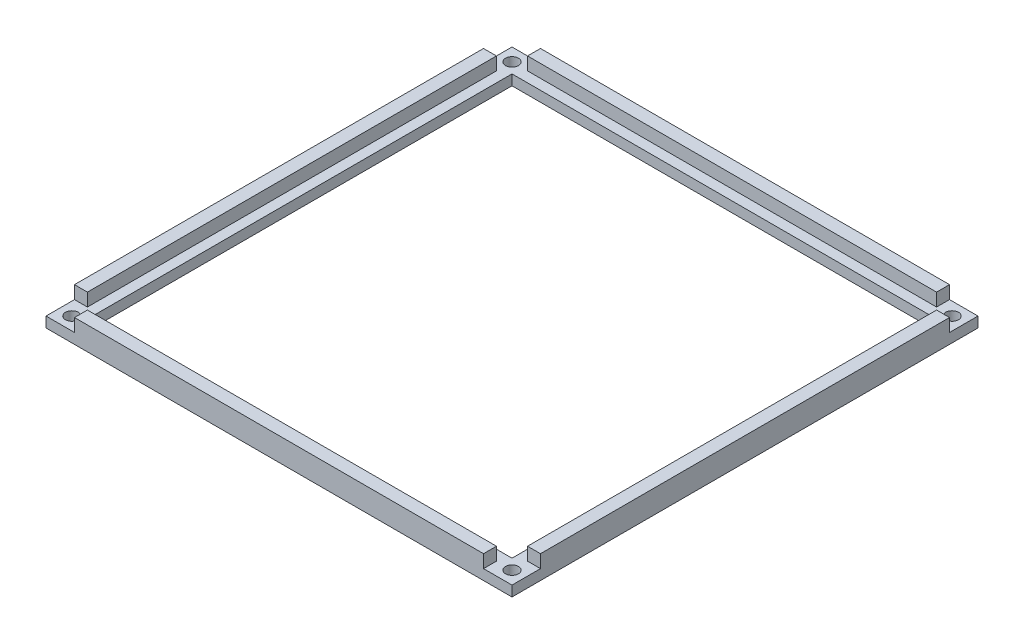
ISO-10303-21;
HEADER;
FILE_DESCRIPTION(('STEP AP214'),'2;1');
FILE_NAME('part.step','',(''),(''),'','','');
FILE_SCHEMA(('AUTOMOTIVE_DESIGN { 1 0 10303 214 1 1 1 1 }'));
ENDSEC;
DATA;
#1=APPLICATION_CONTEXT('core data for automotive mechanical design processes');
#2=APPLICATION_PROTOCOL_DEFINITION('international standard','automotive_design',2000,#1);
#3=PRODUCT_CONTEXT('',#1,'mechanical');
#4=PRODUCT('Part','Part','',(#3));
#5=PRODUCT_RELATED_PRODUCT_CATEGORY('part','',(#4));
#6=PRODUCT_DEFINITION_FORMATION('','',#4);
#7=PRODUCT_DEFINITION_CONTEXT('part definition',#1,'design');
#8=PRODUCT_DEFINITION('design','',#6,#7);
#9=PRODUCT_DEFINITION_SHAPE('','',#8);
#10=(LENGTH_UNIT() NAMED_UNIT(*) SI_UNIT(.MILLI.,.METRE.));
#11=(NAMED_UNIT(*) PLANE_ANGLE_UNIT() SI_UNIT($,.RADIAN.));
#12=(NAMED_UNIT(*) SI_UNIT($,.STERADIAN.) SOLID_ANGLE_UNIT());
#13=UNCERTAINTY_MEASURE_WITH_UNIT(LENGTH_MEASURE(1.E-05),#10,'distance_accuracy_value','');
#14=(GEOMETRIC_REPRESENTATION_CONTEXT(3) GLOBAL_UNCERTAINTY_ASSIGNED_CONTEXT((#13)) GLOBAL_UNIT_ASSIGNED_CONTEXT((#10,
#11,#12)) REPRESENTATION_CONTEXT('',''));
#15=CARTESIAN_POINT('',(0.,0.,0.));
#16=DIRECTION('',(0.,0.,1.));
#17=DIRECTION('',(1.,0.,0.));
#18=AXIS2_PLACEMENT_3D('',#15,#16,#17);
#19=CARTESIAN_POINT('',(0.,4.,0.));
#20=DIRECTION('',(0.,-1.,0.));
#21=DIRECTION('',(0.,0.,-1.));
#22=AXIS2_PLACEMENT_3D('',#19,#20,#21);
#23=PLANE('',#22);
#24=DIRECTION('',(0.,0.,1.));
#25=VECTOR('',#24,1.);
#26=CARTESIAN_POINT('',(19.,4.,-181.));
#27=LINE('',#26,#25);
#28=CARTESIAN_POINT('',(19.,4.,-181.));
#29=VERTEX_POINT('',#28);
#30=CARTESIAN_POINT('',(19.,4.,-19.));
#31=VERTEX_POINT('',#30);
#32=EDGE_CURVE('E204',#29,#31,#27,.T.);
#33=ORIENTED_EDGE('',*,*,#32,.F.);
#34=DIRECTION('',(-1.,0.,0.));
#35=VECTOR('',#34,1.);
#36=CARTESIAN_POINT('',(181.,4.,-181.));
#37=LINE('',#36,#35);
#38=CARTESIAN_POINT('',(181.,4.,-181.));
#39=VERTEX_POINT('',#38);
#40=EDGE_CURVE('E47',#39,#29,#37,.T.);
#41=ORIENTED_EDGE('',*,*,#40,.F.);
#42=DIRECTION('',(0.,0.,-1.));
#43=VECTOR('',#42,1.);
#44=CARTESIAN_POINT('',(181.,4.,-19.));
#45=LINE('',#44,#43);
#46=CARTESIAN_POINT('',(181.,4.,-19.));
#47=VERTEX_POINT('',#46);
#48=EDGE_CURVE('E210',#47,#39,#45,.T.);
#49=ORIENTED_EDGE('',*,*,#48,.F.);
#50=DIRECTION('',(1.,0.,0.));
#51=VECTOR('',#50,1.);
#52=CARTESIAN_POINT('',(19.,4.,-19.));
#53=LINE('',#52,#51);
#54=EDGE_CURVE('E195',#31,#47,#53,.T.);
#55=ORIENTED_EDGE('',*,*,#54,.F.);
#56=EDGE_LOOP('',(#33,#41,#49,#55));
#57=FACE_BOUND('',#56,.T.);
#58=CARTESIAN_POINT('',(15.,4.,-15.));
#59=DIRECTION('',(0.,1.,0.));
#60=DIRECTION('',(0.,0.,1.));
#61=AXIS2_PLACEMENT_3D('',#58,#59,#60);
#62=CIRCLE('',#61,2.5);
#63=CARTESIAN_POINT('',(15.,4.,-12.5));
#64=VERTEX_POINT('',#63);
#65=EDGE_CURVE('E364',#64,#64,#62,.T.);
#66=ORIENTED_EDGE('',*,*,#65,.F.);
#67=EDGE_LOOP('',(#66));
#68=FACE_BOUND('',#67,.T.);
#69=CARTESIAN_POINT('',(185.,4.,-15.0000000000001));
#70=DIRECTION('',(0.,1.,0.));
#71=DIRECTION('',(0.,0.,1.));
#72=AXIS2_PLACEMENT_3D('',#69,#70,#71);
#73=CIRCLE('',#72,2.5);
#74=CARTESIAN_POINT('',(185.,4.,-12.5000000000001));
#75=VERTEX_POINT('',#74);
#76=EDGE_CURVE('E370',#75,#75,#73,.T.);
#77=ORIENTED_EDGE('',*,*,#76,.F.);
#78=EDGE_LOOP('',(#77));
#79=FACE_BOUND('',#78,.T.);
#80=CARTESIAN_POINT('',(185.,4.,-185.));
#81=DIRECTION('',(0.,1.,0.));
#82=DIRECTION('',(0.,0.,1.));
#83=AXIS2_PLACEMENT_3D('',#80,#81,#82);
#84=CIRCLE('',#83,2.5);
#85=CARTESIAN_POINT('',(185.,4.,-182.5));
#86=VERTEX_POINT('',#85);
#87=EDGE_CURVE('E376',#86,#86,#84,.T.);
#88=ORIENTED_EDGE('',*,*,#87,.F.);
#89=EDGE_LOOP('',(#88));
#90=FACE_BOUND('',#89,.T.);
#91=CARTESIAN_POINT('',(15.,4.,-185.));
#92=DIRECTION('',(0.,1.,0.));
#93=DIRECTION('',(0.,0.,1.));
#94=AXIS2_PLACEMENT_3D('',#91,#92,#93);
#95=CIRCLE('',#94,2.5);
#96=CARTESIAN_POINT('',(15.,4.,-182.5));
#97=VERTEX_POINT('',#96);
#98=EDGE_CURVE('E382',#97,#97,#95,.T.);
#99=ORIENTED_EDGE('',*,*,#98,.F.);
#100=EDGE_LOOP('',(#99));
#101=FACE_BOUND('',#100,.T.);
#102=DIRECTION('',(1.,0.,0.));
#103=VECTOR('',#102,1.);
#104=CARTESIAN_POINT('',(10.0000000000015,4.,-21.0000000000009));
#105=LINE('',#104,#103);
#106=CARTESIAN_POINT('',(10.0000000000015,4.,-21.0000000000009));
#107=VERTEX_POINT('',#106);
#108=CARTESIAN_POINT('',(15.0000000000015,4.,-21.0000000000008));
#109=VERTEX_POINT('',#108);
#110=EDGE_CURVE('E217',#107,#109,#105,.T.);
#111=ORIENTED_EDGE('',*,*,#110,.F.);
#112=DIRECTION('',(0.,0.,1.));
#113=VECTOR('',#112,1.);
#114=CARTESIAN_POINT('',(9.99999999999997,4.,-190.));
#115=LINE('',#114,#113);
#116=CARTESIAN_POINT('',(9.99999999999997,4.,-10.));
#117=VERTEX_POINT('',#116);
#118=EDGE_CURVE('E339',#107,#117,#115,.T.);
#119=ORIENTED_EDGE('',*,*,#118,.T.);
#120=DIRECTION('',(1.,0.,0.));
#121=VECTOR('',#120,1.);
#122=CARTESIAN_POINT('',(9.99999999999997,4.,-10.));
#123=LINE('',#122,#121);
#124=CARTESIAN_POINT('',(21.0000000000018,4.,-10.));
#125=VERTEX_POINT('',#124);
#126=EDGE_CURVE('E343',#117,#125,#123,.T.);
#127=ORIENTED_EDGE('',*,*,#126,.T.);
#128=DIRECTION('',(0.,0.,1.));
#129=VECTOR('',#128,1.);
#130=CARTESIAN_POINT('',(21.0000000000018,4.,-10.0000000000028));
#131=LINE('',#130,#129);
#132=CARTESIAN_POINT('',(21.0000000000018,4.,-15.0000000000028));
#133=VERTEX_POINT('',#132);
#134=EDGE_CURVE('E254',#133,#125,#131,.T.);
#135=ORIENTED_EDGE('',*,*,#134,.F.);
#136=DIRECTION('',(-1.,0.,0.));
#137=VECTOR('',#136,1.);
#138=CARTESIAN_POINT('',(179.000000000002,4.,-15.0000000000017));
#139=LINE('',#138,#137);
#140=CARTESIAN_POINT('',(179.000000000002,4.,-15.0000000000017));
#141=VERTEX_POINT('',#140);
#142=EDGE_CURVE('E263',#141,#133,#139,.T.);
#143=ORIENTED_EDGE('',*,*,#142,.F.);
#144=DIRECTION('',(0.,0.,-1.));
#145=VECTOR('',#144,1.);
#146=CARTESIAN_POINT('',(179.000000000002,4.,-10.0000000000017));
#147=LINE('',#146,#145);
#148=CARTESIAN_POINT('',(179.000000000002,4.,-10.0000000000017));
#149=VERTEX_POINT('',#148);
#150=EDGE_CURVE('E249',#149,#141,#147,.T.);
#151=ORIENTED_EDGE('',*,*,#150,.F.);
#152=CARTESIAN_POINT('',(190.,4.,-10.));
#153=VERTEX_POINT('',#152);
#154=EDGE_CURVE('E342',#149,#153,#123,.T.);
#155=ORIENTED_EDGE('',*,*,#154,.T.);
#156=DIRECTION('',(0.,0.,-1.));
#157=VECTOR('',#156,1.);
#158=CARTESIAN_POINT('',(190.,4.,-10.));
#159=LINE('',#158,#157);
#160=CARTESIAN_POINT('',(190.,4.,-21.000000000002));
#161=VERTEX_POINT('',#160);
#162=EDGE_CURVE('E346',#153,#161,#159,.T.);
#163=ORIENTED_EDGE('',*,*,#162,.T.);
#164=DIRECTION('',(1.,0.,0.));
#165=VECTOR('',#164,1.);
#166=CARTESIAN_POINT('',(190.,4.,-21.000000000002));
#167=LINE('',#166,#165);
#168=CARTESIAN_POINT('',(185.,4.,-21.0000000000021));
#169=VERTEX_POINT('',#168);
#170=EDGE_CURVE('E284',#169,#161,#167,.T.);
#171=ORIENTED_EDGE('',*,*,#170,.F.);
#172=DIRECTION('',(0.,0.,1.));
#173=VECTOR('',#172,1.);
#174=CARTESIAN_POINT('',(185.,4.,-179.000000000002));
#175=LINE('',#174,#173);
#176=CARTESIAN_POINT('',(185.,4.,-179.000000000002));
#177=VERTEX_POINT('',#176);
#178=EDGE_CURVE('E293',#177,#169,#175,.T.);
#179=ORIENTED_EDGE('',*,*,#178,.F.);
#180=DIRECTION('',(-1.,0.,0.));
#181=VECTOR('',#180,1.);
#182=CARTESIAN_POINT('',(190.,4.,-179.000000000002));
#183=LINE('',#182,#181);
#184=CARTESIAN_POINT('',(190.,4.,-179.000000000002));
#185=VERTEX_POINT('',#184);
#186=EDGE_CURVE('E279',#185,#177,#183,.T.);
#187=ORIENTED_EDGE('',*,*,#186,.F.);
#188=CARTESIAN_POINT('',(190.,4.,-190.));
#189=VERTEX_POINT('',#188);
#190=EDGE_CURVE('E345',#185,#189,#159,.T.);
#191=ORIENTED_EDGE('',*,*,#190,.T.);
#192=DIRECTION('',(-1.,0.,0.));
#193=VECTOR('',#192,1.);
#194=CARTESIAN_POINT('',(190.,4.,-190.));
#195=LINE('',#194,#193);
#196=CARTESIAN_POINT('',(179.,4.,-190.));
#197=VERTEX_POINT('',#196);
#198=EDGE_CURVE('E349',#189,#197,#195,.T.);
#199=ORIENTED_EDGE('',*,*,#198,.T.);
#200=DIRECTION('',(0.,0.,-1.));
#201=VECTOR('',#200,1.);
#202=CARTESIAN_POINT('',(179.,4.,-190.));
#203=LINE('',#202,#201);
#204=CARTESIAN_POINT('',(179.,4.,-185.));
#205=VERTEX_POINT('',#204);
#206=EDGE_CURVE('E314',#205,#197,#203,.T.);
#207=ORIENTED_EDGE('',*,*,#206,.F.);
#208=DIRECTION('',(1.,0.,0.));
#209=VECTOR('',#208,1.);
#210=CARTESIAN_POINT('',(21.,4.,-185.));
#211=LINE('',#210,#209);
#212=CARTESIAN_POINT('',(21.,4.,-185.));
#213=VERTEX_POINT('',#212);
#214=EDGE_CURVE('E323',#213,#205,#211,.T.);
#215=ORIENTED_EDGE('',*,*,#214,.F.);
#216=DIRECTION('',(0.,0.,1.));
#217=VECTOR('',#216,1.);
#218=CARTESIAN_POINT('',(21.,4.,-190.));
#219=LINE('',#218,#217);
#220=CARTESIAN_POINT('',(21.0000000000001,4.,-190.));
#221=VERTEX_POINT('',#220);
#222=EDGE_CURVE('E309',#221,#213,#219,.T.);
#223=ORIENTED_EDGE('',*,*,#222,.F.);
#224=CARTESIAN_POINT('',(9.99999999999997,4.,-190.));
#225=VERTEX_POINT('',#224);
#226=EDGE_CURVE('E348',#221,#225,#195,.T.);
#227=ORIENTED_EDGE('',*,*,#226,.T.);
#228=CARTESIAN_POINT('',(9.99999999999997,4.,-179.000000000001));
#229=VERTEX_POINT('',#228);
#230=EDGE_CURVE('E340',#225,#229,#115,.T.);
#231=ORIENTED_EDGE('',*,*,#230,.T.);
#232=DIRECTION('',(-1.,0.,0.));
#233=VECTOR('',#232,1.);
#234=CARTESIAN_POINT('',(10.0000000000032,4.,-179.000000000001));
#235=LINE('',#234,#233);
#236=CARTESIAN_POINT('',(15.0000000000032,4.,-179.000000000001));
#237=VERTEX_POINT('',#236);
#238=EDGE_CURVE('E224',#237,#229,#235,.T.);
#239=ORIENTED_EDGE('',*,*,#238,.F.);
#240=DIRECTION('',(0.,0.,-1.));
#241=VECTOR('',#240,1.);
#242=CARTESIAN_POINT('',(15.0000000000015,4.,-21.0000000000008));
#243=LINE('',#242,#241);
#244=EDGE_CURVE('E233',#109,#237,#243,.T.);
#245=ORIENTED_EDGE('',*,*,#244,.F.);
#246=EDGE_LOOP('',(#111,#119,#127,#135,#143,#151,#155,#163,#171,#179,#187,#191,#199,#207,#215,
#223,#227,#231,#239,#245));
#247=FACE_BOUND('',#246,.T.);
#248=ADVANCED_FACE('F32',(#57,#68,#79,#90,#101,#247),#23,.F.);
#249=CARTESIAN_POINT('',(0.,0.,0.));
#250=DIRECTION('',(0.,-1.,0.));
#251=DIRECTION('',(0.,0.,-1.));
#252=AXIS2_PLACEMENT_3D('',#249,#250,#251);
#253=PLANE('',#252);
#254=DIRECTION('',(1.,0.,0.));
#255=VECTOR('',#254,1.);
#256=CARTESIAN_POINT('',(0.,0.,-181.));
#257=LINE('',#256,#255);
#258=CARTESIAN_POINT('',(19.,0.,-181.));
#259=VERTEX_POINT('',#258);
#260=CARTESIAN_POINT('',(181.,0.,-181.));
#261=VERTEX_POINT('',#260);
#262=EDGE_CURVE('E11',#259,#261,#257,.T.);
#263=ORIENTED_EDGE('',*,*,#262,.F.);
#264=DIRECTION('',(0.,0.,-1.));
#265=VECTOR('',#264,1.);
#266=CARTESIAN_POINT('',(19.,0.,0.));
#267=LINE('',#266,#265);
#268=CARTESIAN_POINT('',(19.,0.,-19.));
#269=VERTEX_POINT('',#268);
#270=EDGE_CURVE('E399',#269,#259,#267,.T.);
#271=ORIENTED_EDGE('',*,*,#270,.F.);
#272=DIRECTION('',(-1.,0.,0.));
#273=VECTOR('',#272,1.);
#274=CARTESIAN_POINT('',(0.,0.,-19.));
#275=LINE('',#274,#273);
#276=CARTESIAN_POINT('',(181.,0.,-19.));
#277=VERTEX_POINT('',#276);
#278=EDGE_CURVE('E198',#277,#269,#275,.T.);
#279=ORIENTED_EDGE('',*,*,#278,.F.);
#280=DIRECTION('',(0.,0.,1.));
#281=VECTOR('',#280,1.);
#282=CARTESIAN_POINT('',(181.,0.,0.));
#283=LINE('',#282,#281);
#284=EDGE_CURVE('E40',#261,#277,#283,.T.);
#285=ORIENTED_EDGE('',*,*,#284,.F.);
#286=EDGE_LOOP('',(#263,#271,#279,#285));
#287=FACE_BOUND('',#286,.T.);
#288=CARTESIAN_POINT('',(15.,0.,-15.));
#289=DIRECTION('',(0.,1.,0.));
#290=DIRECTION('',(0.,0.,1.));
#291=AXIS2_PLACEMENT_3D('',#288,#289,#290);
#292=CIRCLE('',#291,2.5);
#293=CARTESIAN_POINT('',(15.,0.,-12.5));
#294=VERTEX_POINT('',#293);
#295=EDGE_CURVE('E355',#294,#294,#292,.T.);
#296=ORIENTED_EDGE('',*,*,#295,.T.);
#297=EDGE_LOOP('',(#296));
#298=FACE_BOUND('',#297,.T.);
#299=CARTESIAN_POINT('',(185.,0.,-185.));
#300=DIRECTION('',(0.,1.,0.));
#301=DIRECTION('',(0.,0.,1.));
#302=AXIS2_PLACEMENT_3D('',#299,#300,#301);
#303=CIRCLE('',#302,2.5);
#304=CARTESIAN_POINT('',(185.,0.,-182.5));
#305=VERTEX_POINT('',#304);
#306=EDGE_CURVE('E373',#305,#305,#303,.T.);
#307=ORIENTED_EDGE('',*,*,#306,.T.);
#308=EDGE_LOOP('',(#307));
#309=FACE_BOUND('',#308,.T.);
#310=CARTESIAN_POINT('',(15.,0.,-185.));
#311=DIRECTION('',(0.,1.,0.));
#312=DIRECTION('',(0.,0.,1.));
#313=AXIS2_PLACEMENT_3D('',#310,#311,#312);
#314=CIRCLE('',#313,2.5);
#315=CARTESIAN_POINT('',(15.,0.,-182.5));
#316=VERTEX_POINT('',#315);
#317=EDGE_CURVE('E379',#316,#316,#314,.T.);
#318=ORIENTED_EDGE('',*,*,#317,.T.);
#319=EDGE_LOOP('',(#318));
#320=FACE_BOUND('',#319,.T.);
#321=CARTESIAN_POINT('',(185.,0.,-15.0000000000001));
#322=DIRECTION('',(0.,1.,0.));
#323=DIRECTION('',(0.,0.,1.));
#324=AXIS2_PLACEMENT_3D('',#321,#322,#323);
#325=CIRCLE('',#324,2.5);
#326=CARTESIAN_POINT('',(185.,0.,-12.5000000000001));
#327=VERTEX_POINT('',#326);
#328=EDGE_CURVE('E367',#327,#327,#325,.T.);
#329=ORIENTED_EDGE('',*,*,#328,.T.);
#330=EDGE_LOOP('',(#329));
#331=FACE_BOUND('',#330,.T.);
#332=DIRECTION('',(-1.,0.,0.));
#333=VECTOR('',#332,1.);
#334=CARTESIAN_POINT('',(0.,0.,-10.));
#335=LINE('',#334,#333);
#336=CARTESIAN_POINT('',(190.,0.,-10.));
#337=VERTEX_POINT('',#336);
#338=CARTESIAN_POINT('',(9.99999999999997,0.,-10.));
#339=VERTEX_POINT('',#338);
#340=EDGE_CURVE('E385',#337,#339,#335,.T.);
#341=ORIENTED_EDGE('',*,*,#340,.T.);
#342=DIRECTION('',(0.,0.,-1.));
#343=VECTOR('',#342,1.);
#344=CARTESIAN_POINT('',(9.99999999999997,0.,0.));
#345=LINE('',#344,#343);
#346=CARTESIAN_POINT('',(9.99999999999997,0.,-190.));
#347=VERTEX_POINT('',#346);
#348=EDGE_CURVE('E396',#339,#347,#345,.T.);
#349=ORIENTED_EDGE('',*,*,#348,.T.);
#350=DIRECTION('',(1.,0.,0.));
#351=VECTOR('',#350,1.);
#352=CARTESIAN_POINT('',(0.,0.,-190.));
#353=LINE('',#352,#351);
#354=CARTESIAN_POINT('',(190.,0.,-190.));
#355=VERTEX_POINT('',#354);
#356=EDGE_CURVE('E393',#347,#355,#353,.T.);
#357=ORIENTED_EDGE('',*,*,#356,.T.);
#358=DIRECTION('',(0.,0.,1.));
#359=VECTOR('',#358,1.);
#360=CARTESIAN_POINT('',(190.,0.,0.));
#361=LINE('',#360,#359);
#362=EDGE_CURVE('E390',#355,#337,#361,.T.);
#363=ORIENTED_EDGE('',*,*,#362,.T.);
#364=EDGE_LOOP('',(#341,#349,#357,#363));
#365=FACE_BOUND('',#364,.T.);
#366=ADVANCED_FACE('F34',(#287,#298,#309,#320,#331,#365),#253,.T.);
#367=CARTESIAN_POINT('',(15.,4.,-185.));
#368=DIRECTION('',(0.,-1.,0.));
#369=DIRECTION('',(0.,0.,-1.));
#370=AXIS2_PLACEMENT_3D('',#367,#368,#369);
#371=CYLINDRICAL_SURFACE('',#370,2.5);
#372=ORIENTED_EDGE('',*,*,#98,.T.);
#373=EDGE_LOOP('',(#372));
#374=FACE_BOUND('',#373,.T.);
#375=ORIENTED_EDGE('',*,*,#317,.F.);
#376=EDGE_LOOP('',(#375));
#377=FACE_BOUND('',#376,.T.);
#378=ADVANCED_FACE('F425',(#374,#377),#371,.F.);
#379=CARTESIAN_POINT('',(185.,4.,-185.));
#380=DIRECTION('',(0.,-1.,0.));
#381=DIRECTION('',(0.,0.,-1.));
#382=AXIS2_PLACEMENT_3D('',#379,#380,#381);
#383=CYLINDRICAL_SURFACE('',#382,2.5);
#384=ORIENTED_EDGE('',*,*,#87,.T.);
#385=EDGE_LOOP('',(#384));
#386=FACE_BOUND('',#385,.T.);
#387=ORIENTED_EDGE('',*,*,#306,.F.);
#388=EDGE_LOOP('',(#387));
#389=FACE_BOUND('',#388,.T.);
#390=ADVANCED_FACE('F429',(#386,#389),#383,.F.);
#391=CARTESIAN_POINT('',(185.,4.,-15.0000000000001));
#392=DIRECTION('',(0.,-1.,0.));
#393=DIRECTION('',(0.,0.,-1.));
#394=AXIS2_PLACEMENT_3D('',#391,#392,#393);
#395=CYLINDRICAL_SURFACE('',#394,2.5);
#396=ORIENTED_EDGE('',*,*,#76,.T.);
#397=EDGE_LOOP('',(#396));
#398=FACE_BOUND('',#397,.T.);
#399=ORIENTED_EDGE('',*,*,#328,.F.);
#400=EDGE_LOOP('',(#399));
#401=FACE_BOUND('',#400,.T.);
#402=ADVANCED_FACE('F433',(#398,#401),#395,.F.);
#403=CARTESIAN_POINT('',(15.,4.,-15.));
#404=DIRECTION('',(0.,-1.,0.));
#405=DIRECTION('',(0.,0.,-1.));
#406=AXIS2_PLACEMENT_3D('',#403,#404,#405);
#407=CYLINDRICAL_SURFACE('',#406,2.5);
#408=ORIENTED_EDGE('',*,*,#65,.T.);
#409=EDGE_LOOP('',(#408));
#410=FACE_BOUND('',#409,.T.);
#411=ORIENTED_EDGE('',*,*,#295,.F.);
#412=EDGE_LOOP('',(#411));
#413=FACE_BOUND('',#412,.T.);
#414=ADVANCED_FACE('F437',(#410,#413),#407,.F.);
#415=CARTESIAN_POINT('',(9.99999999999997,-6.,-190.));
#416=DIRECTION('',(-1.,0.,0.));
#417=DIRECTION('',(0.,0.,1.));
#418=AXIS2_PLACEMENT_3D('',#415,#416,#417);
#419=PLANE('',#418);
#420=DIRECTION('',(0.,1.,0.));
#421=VECTOR('',#420,1.);
#422=CARTESIAN_POINT('',(9.99999999999997,-6.,-10.));
#423=LINE('',#422,#421);
#424=EDGE_CURVE('E351',#339,#117,#423,.T.);
#425=ORIENTED_EDGE('',*,*,#424,.T.);
#426=ORIENTED_EDGE('',*,*,#118,.F.);
#427=DIRECTION('',(0.,-1.,0.));
#428=VECTOR('',#427,1.);
#429=CARTESIAN_POINT('',(10.0000000000015,9.,-21.0000000000009));
#430=LINE('',#429,#428);
#431=CARTESIAN_POINT('',(10.0000000000015,9.,-21.0000000000009));
#432=VERTEX_POINT('',#431);
#433=EDGE_CURVE('E246',#432,#107,#430,.T.);
#434=ORIENTED_EDGE('',*,*,#433,.F.);
#435=DIRECTION('',(0.,0.,1.));
#436=VECTOR('',#435,1.);
#437=CARTESIAN_POINT('',(10.0000000000015,9.,-21.0000000000009));
#438=LINE('',#437,#436);
#439=CARTESIAN_POINT('',(10.0000000000032,9.,-179.000000000001));
#440=VERTEX_POINT('',#439);
#441=EDGE_CURVE('E220',#440,#432,#438,.T.);
#442=ORIENTED_EDGE('',*,*,#441,.F.);
#443=DIRECTION('',(0.,-1.,0.));
#444=VECTOR('',#443,1.);
#445=CARTESIAN_POINT('',(10.0000000000032,9.,-179.000000000001));
#446=LINE('',#445,#444);
#447=EDGE_CURVE('E230',#440,#229,#446,.T.);
#448=ORIENTED_EDGE('',*,*,#447,.T.);
#449=ORIENTED_EDGE('',*,*,#230,.F.);
#450=DIRECTION('',(0.,1.,0.));
#451=VECTOR('',#450,1.);
#452=CARTESIAN_POINT('',(9.99999999999997,-6.,-190.));
#453=LINE('',#452,#451);
#454=EDGE_CURVE('E352',#347,#225,#453,.T.);
#455=ORIENTED_EDGE('',*,*,#454,.F.);
#456=ORIENTED_EDGE('',*,*,#348,.F.);
#457=EDGE_LOOP('',(#425,#426,#434,#442,#448,#449,#455,#456));
#458=FACE_BOUND('',#457,.T.);
#459=ADVANCED_FACE('F441',(#458),#419,.T.);
#460=CARTESIAN_POINT('',(190.,-6.,-190.));
#461=DIRECTION('',(0.,0.,-1.));
#462=DIRECTION('',(-1.,0.,0.));
#463=AXIS2_PLACEMENT_3D('',#460,#461,#462);
#464=PLANE('',#463);
#465=ORIENTED_EDGE('',*,*,#454,.T.);
#466=ORIENTED_EDGE('',*,*,#226,.F.);
#467=DIRECTION('',(0.,-1.,0.));
#468=VECTOR('',#467,1.);
#469=CARTESIAN_POINT('',(21.,9.,-190.));
#470=LINE('',#469,#468);
#471=CARTESIAN_POINT('',(21.,9.,-190.));
#472=VERTEX_POINT('',#471);
#473=EDGE_CURVE('E320',#472,#221,#470,.T.);
#474=ORIENTED_EDGE('',*,*,#473,.F.);
#475=DIRECTION('',(-1.,0.,0.));
#476=VECTOR('',#475,1.);
#477=CARTESIAN_POINT('',(21.,9.,-190.));
#478=LINE('',#477,#476);
#479=CARTESIAN_POINT('',(179.,9.,-190.));
#480=VERTEX_POINT('',#479);
#481=EDGE_CURVE('E318',#480,#472,#478,.T.);
#482=ORIENTED_EDGE('',*,*,#481,.F.);
#483=DIRECTION('',(0.,-1.,0.));
#484=VECTOR('',#483,1.);
#485=CARTESIAN_POINT('',(179.,9.,-190.));
#486=LINE('',#485,#484);
#487=EDGE_CURVE('E330',#480,#197,#486,.T.);
#488=ORIENTED_EDGE('',*,*,#487,.T.);
#489=ORIENTED_EDGE('',*,*,#198,.F.);
#490=DIRECTION('',(0.,1.,0.));
#491=VECTOR('',#490,1.);
#492=CARTESIAN_POINT('',(190.,-6.,-190.));
#493=LINE('',#492,#491);
#494=EDGE_CURVE('E356',#355,#189,#493,.T.);
#495=ORIENTED_EDGE('',*,*,#494,.F.);
#496=ORIENTED_EDGE('',*,*,#356,.F.);
#497=EDGE_LOOP('',(#465,#466,#474,#482,#488,#489,#495,#496));
#498=FACE_BOUND('',#497,.T.);
#499=ADVANCED_FACE('F445',(#498),#464,.T.);
#500=CARTESIAN_POINT('',(190.,-6.,-10.));
#501=DIRECTION('',(1.,0.,0.));
#502=DIRECTION('',(0.,0.,-1.));
#503=AXIS2_PLACEMENT_3D('',#500,#501,#502);
#504=PLANE('',#503);
#505=ORIENTED_EDGE('',*,*,#494,.T.);
#506=ORIENTED_EDGE('',*,*,#190,.F.);
#507=DIRECTION('',(0.,-1.,0.));
#508=VECTOR('',#507,1.);
#509=CARTESIAN_POINT('',(190.,9.,-179.000000000002));
#510=LINE('',#509,#508);
#511=CARTESIAN_POINT('',(190.,9.,-179.000000000002));
#512=VERTEX_POINT('',#511);
#513=EDGE_CURVE('E306',#512,#185,#510,.T.);
#514=ORIENTED_EDGE('',*,*,#513,.F.);
#515=DIRECTION('',(0.,0.,-1.));
#516=VECTOR('',#515,1.);
#517=CARTESIAN_POINT('',(190.,9.,-179.000000000002));
#518=LINE('',#517,#516);
#519=CARTESIAN_POINT('',(190.,9.,-21.000000000002));
#520=VERTEX_POINT('',#519);
#521=EDGE_CURVE('E280',#520,#512,#518,.T.);
#522=ORIENTED_EDGE('',*,*,#521,.F.);
#523=DIRECTION('',(0.,-1.,0.));
#524=VECTOR('',#523,1.);
#525=CARTESIAN_POINT('',(190.,9.,-21.000000000002));
#526=LINE('',#525,#524);
#527=EDGE_CURVE('E290',#520,#161,#526,.T.);
#528=ORIENTED_EDGE('',*,*,#527,.T.);
#529=ORIENTED_EDGE('',*,*,#162,.F.);
#530=DIRECTION('',(0.,1.,0.));
#531=VECTOR('',#530,1.);
#532=CARTESIAN_POINT('',(190.,-6.,-10.));
#533=LINE('',#532,#531);
#534=EDGE_CURVE('E359',#337,#153,#533,.T.);
#535=ORIENTED_EDGE('',*,*,#534,.F.);
#536=ORIENTED_EDGE('',*,*,#362,.F.);
#537=EDGE_LOOP('',(#505,#506,#514,#522,#528,#529,#535,#536));
#538=FACE_BOUND('',#537,.T.);
#539=ADVANCED_FACE('F451',(#538),#504,.T.);
#540=CARTESIAN_POINT('',(9.99999999999997,-6.,-10.));
#541=DIRECTION('',(0.,0.,1.));
#542=DIRECTION('',(1.,0.,0.));
#543=AXIS2_PLACEMENT_3D('',#540,#541,#542);
#544=PLANE('',#543);
#545=ORIENTED_EDGE('',*,*,#534,.T.);
#546=ORIENTED_EDGE('',*,*,#154,.F.);
#547=DIRECTION('',(0.,-1.,0.));
#548=VECTOR('',#547,1.);
#549=CARTESIAN_POINT('',(179.000000000002,9.,-10.0000000000017));
#550=LINE('',#549,#548);
#551=CARTESIAN_POINT('',(179.000000000002,9.,-10.0000000000017));
#552=VERTEX_POINT('',#551);
#553=EDGE_CURVE('E276',#552,#149,#550,.T.);
#554=ORIENTED_EDGE('',*,*,#553,.F.);
#555=DIRECTION('',(1.,0.,0.));
#556=VECTOR('',#555,1.);
#557=CARTESIAN_POINT('',(179.000000000002,9.,-10.0000000000017));
#558=LINE('',#557,#556);
#559=CARTESIAN_POINT('',(21.0000000000018,9.,-10.0000000000028));
#560=VERTEX_POINT('',#559);
#561=EDGE_CURVE('E250',#560,#552,#558,.T.);
#562=ORIENTED_EDGE('',*,*,#561,.F.);
#563=DIRECTION('',(0.,-1.,0.));
#564=VECTOR('',#563,1.);
#565=CARTESIAN_POINT('',(21.0000000000018,9.,-10.0000000000028));
#566=LINE('',#565,#564);
#567=EDGE_CURVE('E260',#560,#125,#566,.T.);
#568=ORIENTED_EDGE('',*,*,#567,.T.);
#569=ORIENTED_EDGE('',*,*,#126,.F.);
#570=ORIENTED_EDGE('',*,*,#424,.F.);
#571=ORIENTED_EDGE('',*,*,#340,.F.);
#572=EDGE_LOOP('',(#545,#546,#554,#562,#568,#569,#570,#571));
#573=FACE_BOUND('',#572,.T.);
#574=ADVANCED_FACE('F447',(#573),#544,.T.);
#575=CARTESIAN_POINT('',(21.,9.,-190.));
#576=DIRECTION('',(1.,0.,0.));
#577=DIRECTION('',(0.,0.,-1.));
#578=AXIS2_PLACEMENT_3D('',#575,#576,#577);
#579=PLANE('',#578);
#580=ORIENTED_EDGE('',*,*,#222,.T.);
#581=DIRECTION('',(0.,-1.,0.));
#582=VECTOR('',#581,1.);
#583=CARTESIAN_POINT('',(21.,9.,-185.));
#584=LINE('',#583,#582);
#585=CARTESIAN_POINT('',(21.,9.,-185.));
#586=VERTEX_POINT('',#585);
#587=EDGE_CURVE('E336',#586,#213,#584,.T.);
#588=ORIENTED_EDGE('',*,*,#587,.F.);
#589=DIRECTION('',(0.,0.,1.));
#590=VECTOR('',#589,1.);
#591=CARTESIAN_POINT('',(21.,9.,-190.));
#592=LINE('',#591,#590);
#593=EDGE_CURVE('E310',#472,#586,#592,.T.);
#594=ORIENTED_EDGE('',*,*,#593,.F.);
#595=ORIENTED_EDGE('',*,*,#473,.T.);
#596=EDGE_LOOP('',(#580,#588,#594,#595));
#597=FACE_BOUND('',#596,.T.);
#598=ADVANCED_FACE('F450',(#597),#579,.F.);
#599=CARTESIAN_POINT('',(21.,9.,-185.));
#600=DIRECTION('',(0.,0.,-1.));
#601=DIRECTION('',(-1.,0.,0.));
#602=AXIS2_PLACEMENT_3D('',#599,#600,#601);
#603=PLANE('',#602);
#604=ORIENTED_EDGE('',*,*,#214,.T.);
#605=DIRECTION('',(0.,-1.,0.));
#606=VECTOR('',#605,1.);
#607=CARTESIAN_POINT('',(179.,9.,-185.));
#608=LINE('',#607,#606);
#609=CARTESIAN_POINT('',(179.,9.,-185.));
#610=VERTEX_POINT('',#609);
#611=EDGE_CURVE('E333',#610,#205,#608,.T.);
#612=ORIENTED_EDGE('',*,*,#611,.F.);
#613=DIRECTION('',(1.,0.,0.));
#614=VECTOR('',#613,1.);
#615=CARTESIAN_POINT('',(21.,9.,-185.));
#616=LINE('',#615,#614);
#617=EDGE_CURVE('E313',#586,#610,#616,.T.);
#618=ORIENTED_EDGE('',*,*,#617,.F.);
#619=ORIENTED_EDGE('',*,*,#587,.T.);
#620=EDGE_LOOP('',(#604,#612,#618,#619));
#621=FACE_BOUND('',#620,.T.);
#622=ADVANCED_FACE('F461',(#621),#603,.F.);
#623=CARTESIAN_POINT('',(179.,9.,-190.));
#624=DIRECTION('',(-1.,0.,0.));
#625=DIRECTION('',(0.,0.,1.));
#626=AXIS2_PLACEMENT_3D('',#623,#624,#625);
#627=PLANE('',#626);
#628=ORIENTED_EDGE('',*,*,#206,.T.);
#629=ORIENTED_EDGE('',*,*,#487,.F.);
#630=DIRECTION('',(0.,0.,-1.));
#631=VECTOR('',#630,1.);
#632=CARTESIAN_POINT('',(179.,9.,-190.));
#633=LINE('',#632,#631);
#634=EDGE_CURVE('E316',#610,#480,#633,.T.);
#635=ORIENTED_EDGE('',*,*,#634,.F.);
#636=ORIENTED_EDGE('',*,*,#611,.T.);
#637=EDGE_LOOP('',(#628,#629,#635,#636));
#638=FACE_BOUND('',#637,.T.);
#639=ADVANCED_FACE('F465',(#638),#627,.F.);
#640=CARTESIAN_POINT('',(0.,9.,0.));
#641=DIRECTION('',(0.,1.,0.));
#642=DIRECTION('',(0.,0.,1.));
#643=AXIS2_PLACEMENT_3D('',#640,#641,#642);
#644=PLANE('',#643);
#645=ORIENTED_EDGE('',*,*,#593,.T.);
#646=ORIENTED_EDGE('',*,*,#617,.T.);
#647=ORIENTED_EDGE('',*,*,#634,.T.);
#648=ORIENTED_EDGE('',*,*,#481,.T.);
#649=EDGE_LOOP('',(#645,#646,#647,#648));
#650=FACE_BOUND('',#649,.T.);
#651=ADVANCED_FACE('F469',(#650),#644,.T.);
#652=CARTESIAN_POINT('',(190.,9.,-179.000000000002));
#653=DIRECTION('',(0.,0.,1.));
#654=DIRECTION('',(1.,0.,0.));
#655=AXIS2_PLACEMENT_3D('',#652,#653,#654);
#656=PLANE('',#655);
#657=ORIENTED_EDGE('',*,*,#186,.T.);
#658=DIRECTION('',(0.,-1.,0.));
#659=VECTOR('',#658,1.);
#660=CARTESIAN_POINT('',(185.,9.,-179.000000000002));
#661=LINE('',#660,#659);
#662=CARTESIAN_POINT('',(185.,9.,-179.000000000002));
#663=VERTEX_POINT('',#662);
#664=EDGE_CURVE('E303',#663,#177,#661,.T.);
#665=ORIENTED_EDGE('',*,*,#664,.F.);
#666=DIRECTION('',(-1.,0.,0.));
#667=VECTOR('',#666,1.);
#668=CARTESIAN_POINT('',(190.,9.,-179.000000000002));
#669=LINE('',#668,#667);
#670=EDGE_CURVE('E283',#512,#663,#669,.T.);
#671=ORIENTED_EDGE('',*,*,#670,.F.);
#672=ORIENTED_EDGE('',*,*,#513,.T.);
#673=EDGE_LOOP('',(#657,#665,#671,#672));
#674=FACE_BOUND('',#673,.T.);
#675=ADVANCED_FACE('F473',(#674),#656,.F.);
#676=CARTESIAN_POINT('',(185.,9.,-179.000000000002));
#677=DIRECTION('',(1.,0.,0.));
#678=DIRECTION('',(0.,0.,-1.));
#679=AXIS2_PLACEMENT_3D('',#676,#677,#678);
#680=PLANE('',#679);
#681=ORIENTED_EDGE('',*,*,#178,.T.);
#682=DIRECTION('',(0.,-1.,0.));
#683=VECTOR('',#682,1.);
#684=CARTESIAN_POINT('',(185.,9.,-21.0000000000021));
#685=LINE('',#684,#683);
#686=CARTESIAN_POINT('',(185.,9.,-21.0000000000021));
#687=VERTEX_POINT('',#686);
#688=EDGE_CURVE('E300',#687,#169,#685,.T.);
#689=ORIENTED_EDGE('',*,*,#688,.F.);
#690=DIRECTION('',(0.,0.,1.));
#691=VECTOR('',#690,1.);
#692=CARTESIAN_POINT('',(185.,9.,-179.000000000002));
#693=LINE('',#692,#691);
#694=EDGE_CURVE('E286',#663,#687,#693,.T.);
#695=ORIENTED_EDGE('',*,*,#694,.F.);
#696=ORIENTED_EDGE('',*,*,#664,.T.);
#697=EDGE_LOOP('',(#681,#689,#695,#696));
#698=FACE_BOUND('',#697,.T.);
#699=ADVANCED_FACE('F477',(#698),#680,.F.);
#700=CARTESIAN_POINT('',(190.,9.,-21.000000000002));
#701=DIRECTION('',(0.,0.,-1.));
#702=DIRECTION('',(-1.,0.,0.));
#703=AXIS2_PLACEMENT_3D('',#700,#701,#702);
#704=PLANE('',#703);
#705=ORIENTED_EDGE('',*,*,#170,.T.);
#706=ORIENTED_EDGE('',*,*,#527,.F.);
#707=DIRECTION('',(1.,0.,0.));
#708=VECTOR('',#707,1.);
#709=CARTESIAN_POINT('',(190.,9.,-21.000000000002));
#710=LINE('',#709,#708);
#711=EDGE_CURVE('E288',#687,#520,#710,.T.);
#712=ORIENTED_EDGE('',*,*,#711,.F.);
#713=ORIENTED_EDGE('',*,*,#688,.T.);
#714=EDGE_LOOP('',(#705,#706,#712,#713));
#715=FACE_BOUND('',#714,.T.);
#716=ADVANCED_FACE('F481',(#715),#704,.F.);
#717=CARTESIAN_POINT('',(0.,9.,0.));
#718=DIRECTION('',(0.,-1.,0.));
#719=DIRECTION('',(0.,0.,-1.));
#720=AXIS2_PLACEMENT_3D('',#717,#718,#719);
#721=PLANE('',#720);
#722=ORIENTED_EDGE('',*,*,#521,.T.);
#723=ORIENTED_EDGE('',*,*,#670,.T.);
#724=ORIENTED_EDGE('',*,*,#694,.T.);
#725=ORIENTED_EDGE('',*,*,#711,.T.);
#726=EDGE_LOOP('',(#722,#723,#724,#725));
#727=FACE_BOUND('',#726,.T.);
#728=ADVANCED_FACE('F485',(#727),#721,.F.);
#729=CARTESIAN_POINT('',(179.000000000002,9.,-10.0000000000017));
#730=DIRECTION('',(-1.,0.,0.));
#731=DIRECTION('',(0.,0.,1.));
#732=AXIS2_PLACEMENT_3D('',#729,#730,#731);
#733=PLANE('',#732);
#734=ORIENTED_EDGE('',*,*,#150,.T.);
#735=DIRECTION('',(0.,-1.,0.));
#736=VECTOR('',#735,1.);
#737=CARTESIAN_POINT('',(179.000000000002,9.,-15.0000000000017));
#738=LINE('',#737,#736);
#739=CARTESIAN_POINT('',(179.000000000002,9.,-15.0000000000017));
#740=VERTEX_POINT('',#739);
#741=EDGE_CURVE('E273',#740,#141,#738,.T.);
#742=ORIENTED_EDGE('',*,*,#741,.F.);
#743=DIRECTION('',(0.,0.,-1.));
#744=VECTOR('',#743,1.);
#745=CARTESIAN_POINT('',(179.000000000002,9.,-10.0000000000017));
#746=LINE('',#745,#744);
#747=EDGE_CURVE('E253',#552,#740,#746,.T.);
#748=ORIENTED_EDGE('',*,*,#747,.F.);
#749=ORIENTED_EDGE('',*,*,#553,.T.);
#750=EDGE_LOOP('',(#734,#742,#748,#749));
#751=FACE_BOUND('',#750,.T.);
#752=ADVANCED_FACE('F489',(#751),#733,.F.);
#753=CARTESIAN_POINT('',(179.000000000002,9.,-15.0000000000017));
#754=DIRECTION('',(0.,0.,1.));
#755=DIRECTION('',(1.,0.,0.));
#756=AXIS2_PLACEMENT_3D('',#753,#754,#755);
#757=PLANE('',#756);
#758=ORIENTED_EDGE('',*,*,#142,.T.);
#759=DIRECTION('',(0.,-1.,0.));
#760=VECTOR('',#759,1.);
#761=CARTESIAN_POINT('',(21.0000000000018,9.,-15.0000000000028));
#762=LINE('',#761,#760);
#763=CARTESIAN_POINT('',(21.0000000000018,9.,-15.0000000000028));
#764=VERTEX_POINT('',#763);
#765=EDGE_CURVE('E270',#764,#133,#762,.T.);
#766=ORIENTED_EDGE('',*,*,#765,.F.);
#767=DIRECTION('',(-1.,0.,0.));
#768=VECTOR('',#767,1.);
#769=CARTESIAN_POINT('',(179.000000000002,9.,-15.0000000000017));
#770=LINE('',#769,#768);
#771=EDGE_CURVE('E256',#740,#764,#770,.T.);
#772=ORIENTED_EDGE('',*,*,#771,.F.);
#773=ORIENTED_EDGE('',*,*,#741,.T.);
#774=EDGE_LOOP('',(#758,#766,#772,#773));
#775=FACE_BOUND('',#774,.T.);
#776=ADVANCED_FACE('F493',(#775),#757,.F.);
#777=CARTESIAN_POINT('',(21.0000000000018,9.,-10.0000000000028));
#778=DIRECTION('',(1.,0.,0.));
#779=DIRECTION('',(0.,0.,-1.));
#780=AXIS2_PLACEMENT_3D('',#777,#778,#779);
#781=PLANE('',#780);
#782=ORIENTED_EDGE('',*,*,#134,.T.);
#783=ORIENTED_EDGE('',*,*,#567,.F.);
#784=DIRECTION('',(0.,0.,1.));
#785=VECTOR('',#784,1.);
#786=CARTESIAN_POINT('',(21.0000000000018,9.,-10.0000000000028));
#787=LINE('',#786,#785);
#788=EDGE_CURVE('E258',#764,#560,#787,.T.);
#789=ORIENTED_EDGE('',*,*,#788,.F.);
#790=ORIENTED_EDGE('',*,*,#765,.T.);
#791=EDGE_LOOP('',(#782,#783,#789,#790));
#792=FACE_BOUND('',#791,.T.);
#793=ADVANCED_FACE('F497',(#792),#781,.F.);
#794=CARTESIAN_POINT('',(0.,9.,0.));
#795=DIRECTION('',(0.,-1.,0.));
#796=DIRECTION('',(0.,0.,-1.));
#797=AXIS2_PLACEMENT_3D('',#794,#795,#796);
#798=PLANE('',#797);
#799=ORIENTED_EDGE('',*,*,#561,.T.);
#800=ORIENTED_EDGE('',*,*,#747,.T.);
#801=ORIENTED_EDGE('',*,*,#771,.T.);
#802=ORIENTED_EDGE('',*,*,#788,.T.);
#803=EDGE_LOOP('',(#799,#800,#801,#802));
#804=FACE_BOUND('',#803,.T.);
#805=ADVANCED_FACE('F501',(#804),#798,.F.);
#806=CARTESIAN_POINT('',(10.0000000000015,9.,-21.0000000000009));
#807=DIRECTION('',(0.,0.,-1.));
#808=DIRECTION('',(-1.,0.,0.));
#809=AXIS2_PLACEMENT_3D('',#806,#807,#808);
#810=PLANE('',#809);
#811=ORIENTED_EDGE('',*,*,#110,.T.);
#812=DIRECTION('',(0.,-1.,0.));
#813=VECTOR('',#812,1.);
#814=CARTESIAN_POINT('',(15.0000000000015,9.,-21.0000000000008));
#815=LINE('',#814,#813);
#816=CARTESIAN_POINT('',(15.0000000000015,9.,-21.0000000000008));
#817=VERTEX_POINT('',#816);
#818=EDGE_CURVE('E243',#817,#109,#815,.T.);
#819=ORIENTED_EDGE('',*,*,#818,.F.);
#820=DIRECTION('',(1.,0.,0.));
#821=VECTOR('',#820,1.);
#822=CARTESIAN_POINT('',(10.0000000000015,9.,-21.0000000000009));
#823=LINE('',#822,#821);
#824=EDGE_CURVE('E223',#432,#817,#823,.T.);
#825=ORIENTED_EDGE('',*,*,#824,.F.);
#826=ORIENTED_EDGE('',*,*,#433,.T.);
#827=EDGE_LOOP('',(#811,#819,#825,#826));
#828=FACE_BOUND('',#827,.T.);
#829=ADVANCED_FACE('F505',(#828),#810,.F.);
#830=CARTESIAN_POINT('',(15.0000000000015,9.,-21.0000000000008));
#831=DIRECTION('',(-1.,0.,0.));
#832=DIRECTION('',(0.,0.,1.));
#833=AXIS2_PLACEMENT_3D('',#830,#831,#832);
#834=PLANE('',#833);
#835=ORIENTED_EDGE('',*,*,#244,.T.);
#836=DIRECTION('',(0.,-1.,0.));
#837=VECTOR('',#836,1.);
#838=CARTESIAN_POINT('',(15.0000000000032,9.,-179.000000000001));
#839=LINE('',#838,#837);
#840=CARTESIAN_POINT('',(15.0000000000032,9.,-179.000000000001));
#841=VERTEX_POINT('',#840);
#842=EDGE_CURVE('E240',#841,#237,#839,.T.);
#843=ORIENTED_EDGE('',*,*,#842,.F.);
#844=DIRECTION('',(0.,0.,-1.));
#845=VECTOR('',#844,1.);
#846=CARTESIAN_POINT('',(15.0000000000015,9.,-21.0000000000008));
#847=LINE('',#846,#845);
#848=EDGE_CURVE('E226',#817,#841,#847,.T.);
#849=ORIENTED_EDGE('',*,*,#848,.F.);
#850=ORIENTED_EDGE('',*,*,#818,.T.);
#851=EDGE_LOOP('',(#835,#843,#849,#850));
#852=FACE_BOUND('',#851,.T.);
#853=ADVANCED_FACE('F509',(#852),#834,.F.);
#854=CARTESIAN_POINT('',(10.0000000000032,9.,-179.000000000001));
#855=DIRECTION('',(0.,0.,1.));
#856=DIRECTION('',(1.,0.,0.));
#857=AXIS2_PLACEMENT_3D('',#854,#855,#856);
#858=PLANE('',#857);
#859=ORIENTED_EDGE('',*,*,#238,.T.);
#860=ORIENTED_EDGE('',*,*,#447,.F.);
#861=DIRECTION('',(-1.,0.,0.));
#862=VECTOR('',#861,1.);
#863=CARTESIAN_POINT('',(10.0000000000032,9.,-179.000000000001));
#864=LINE('',#863,#862);
#865=EDGE_CURVE('E228',#841,#440,#864,.T.);
#866=ORIENTED_EDGE('',*,*,#865,.F.);
#867=ORIENTED_EDGE('',*,*,#842,.T.);
#868=EDGE_LOOP('',(#859,#860,#866,#867));
#869=FACE_BOUND('',#868,.T.);
#870=ADVANCED_FACE('F417',(#869),#858,.F.);
#871=CARTESIAN_POINT('',(0.,9.,0.));
#872=DIRECTION('',(0.,-1.,0.));
#873=DIRECTION('',(0.,0.,-1.));
#874=AXIS2_PLACEMENT_3D('',#871,#872,#873);
#875=PLANE('',#874);
#876=ORIENTED_EDGE('',*,*,#441,.T.);
#877=ORIENTED_EDGE('',*,*,#824,.T.);
#878=ORIENTED_EDGE('',*,*,#848,.T.);
#879=ORIENTED_EDGE('',*,*,#865,.T.);
#880=EDGE_LOOP('',(#876,#877,#878,#879));
#881=FACE_BOUND('',#880,.T.);
#882=ADVANCED_FACE('F410',(#881),#875,.F.);
#883=CARTESIAN_POINT('',(181.,-1.,-181.));
#884=DIRECTION('',(0.,0.,-1.));
#885=DIRECTION('',(-1.,0.,0.));
#886=AXIS2_PLACEMENT_3D('',#883,#884,#885);
#887=PLANE('',#886);
#888=ORIENTED_EDGE('',*,*,#262,.T.);
#889=DIRECTION('',(0.,1.,0.));
#890=VECTOR('',#889,1.);
#891=CARTESIAN_POINT('',(181.,-1.,-181.));
#892=LINE('',#891,#890);
#893=EDGE_CURVE('E215',#261,#39,#892,.T.);
#894=ORIENTED_EDGE('',*,*,#893,.T.);
#895=ORIENTED_EDGE('',*,*,#40,.T.);
#896=DIRECTION('',(0.,1.,0.));
#897=VECTOR('',#896,1.);
#898=CARTESIAN_POINT('',(19.,-1.,-181.));
#899=LINE('',#898,#897);
#900=EDGE_CURVE('E201',#259,#29,#899,.T.);
#901=ORIENTED_EDGE('',*,*,#900,.F.);
#902=EDGE_LOOP('',(#888,#894,#895,#901));
#903=FACE_BOUND('',#902,.T.);
#904=ADVANCED_FACE('F408',(#903),#887,.F.);
#905=CARTESIAN_POINT('',(181.,-1.,-19.));
#906=DIRECTION('',(1.,0.,0.));
#907=DIRECTION('',(0.,0.,-1.));
#908=AXIS2_PLACEMENT_3D('',#905,#906,#907);
#909=PLANE('',#908);
#910=ORIENTED_EDGE('',*,*,#284,.T.);
#911=DIRECTION('',(0.,1.,0.));
#912=VECTOR('',#911,1.);
#913=CARTESIAN_POINT('',(181.,-1.,-19.));
#914=LINE('',#913,#912);
#915=EDGE_CURVE('E200',#277,#47,#914,.T.);
#916=ORIENTED_EDGE('',*,*,#915,.T.);
#917=ORIENTED_EDGE('',*,*,#48,.T.);
#918=ORIENTED_EDGE('',*,*,#893,.F.);
#919=EDGE_LOOP('',(#910,#916,#917,#918));
#920=FACE_BOUND('',#919,.T.);
#921=ADVANCED_FACE('F404',(#920),#909,.F.);
#922=CARTESIAN_POINT('',(19.,-1.,-19.));
#923=DIRECTION('',(0.,0.,1.));
#924=DIRECTION('',(1.,0.,0.));
#925=AXIS2_PLACEMENT_3D('',#922,#923,#924);
#926=PLANE('',#925);
#927=ORIENTED_EDGE('',*,*,#278,.T.);
#928=DIRECTION('',(0.,1.,0.));
#929=VECTOR('',#928,1.);
#930=CARTESIAN_POINT('',(19.,-1.,-19.));
#931=LINE('',#930,#929);
#932=EDGE_CURVE('E55',#269,#31,#931,.T.);
#933=ORIENTED_EDGE('',*,*,#932,.T.);
#934=ORIENTED_EDGE('',*,*,#54,.T.);
#935=ORIENTED_EDGE('',*,*,#915,.F.);
#936=EDGE_LOOP('',(#927,#933,#934,#935));
#937=FACE_BOUND('',#936,.T.);
#938=ADVANCED_FACE('F192',(#937),#926,.F.);
#939=CARTESIAN_POINT('',(19.,-1.,-181.));
#940=DIRECTION('',(-1.,0.,0.));
#941=DIRECTION('',(0.,0.,1.));
#942=AXIS2_PLACEMENT_3D('',#939,#940,#941);
#943=PLANE('',#942);
#944=ORIENTED_EDGE('',*,*,#270,.T.);
#945=ORIENTED_EDGE('',*,*,#900,.T.);
#946=ORIENTED_EDGE('',*,*,#32,.T.);
#947=ORIENTED_EDGE('',*,*,#932,.F.);
#948=EDGE_LOOP('',(#944,#945,#946,#947));
#949=FACE_BOUND('',#948,.T.);
#950=ADVANCED_FACE('F205',(#949),#943,.F.);
#951=CLOSED_SHELL('',(#248,#366,#378,#390,#402,#414,#459,#499,#539,#574,#598,#622,#639,#651,
#675,#699,#716,#728,#752,#776,#793,#805,#829,#853,#870,#882,#904,#921,#938,#950));
#952=MANIFOLD_SOLID_BREP('B2',#951);
#953=ADVANCED_BREP_SHAPE_REPRESENTATION('',(#18,#952),#14);
#954=SHAPE_DEFINITION_REPRESENTATION(#9,#953);
ENDSEC;
END-ISO-10303-21;
